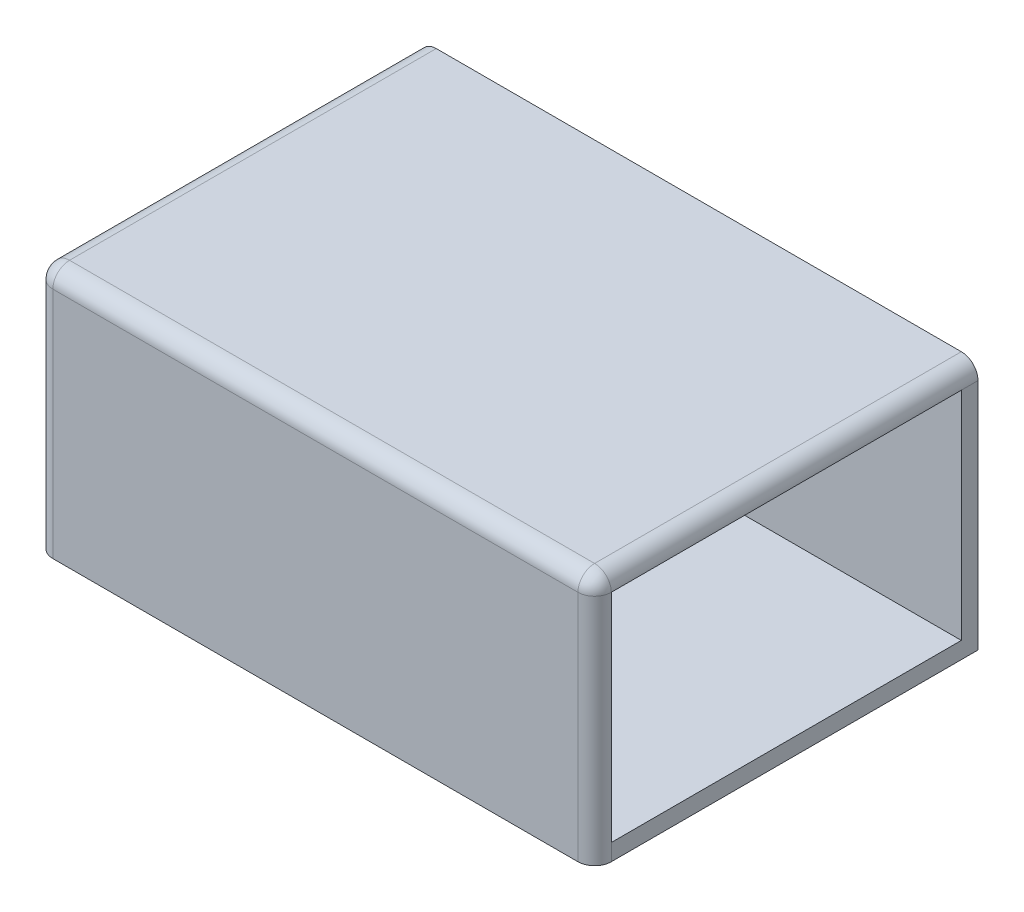
ISO-10303-21;
HEADER;
FILE_DESCRIPTION(('STEP AP214'),'2;1');
FILE_NAME('part.step','',(''),(''),'','','');
FILE_SCHEMA(('AUTOMOTIVE_DESIGN { 1 0 10303 214 1 1 1 1 }'));
ENDSEC;
DATA;
#1=APPLICATION_CONTEXT('core data for automotive mechanical design processes');
#2=APPLICATION_PROTOCOL_DEFINITION('international standard','automotive_design',2000,#1);
#3=PRODUCT_CONTEXT('',#1,'mechanical');
#4=PRODUCT('Part','Part','',(#3));
#5=PRODUCT_RELATED_PRODUCT_CATEGORY('part','',(#4));
#6=PRODUCT_DEFINITION_FORMATION('','',#4);
#7=PRODUCT_DEFINITION_CONTEXT('part definition',#1,'design');
#8=PRODUCT_DEFINITION('design','',#6,#7);
#9=PRODUCT_DEFINITION_SHAPE('','',#8);
#10=(LENGTH_UNIT() NAMED_UNIT(*) SI_UNIT(.MILLI.,.METRE.));
#11=(NAMED_UNIT(*) PLANE_ANGLE_UNIT() SI_UNIT($,.RADIAN.));
#12=(NAMED_UNIT(*) SI_UNIT($,.STERADIAN.) SOLID_ANGLE_UNIT());
#13=UNCERTAINTY_MEASURE_WITH_UNIT(LENGTH_MEASURE(1.E-05),#10,'distance_accuracy_value','');
#14=(GEOMETRIC_REPRESENTATION_CONTEXT(3) GLOBAL_UNCERTAINTY_ASSIGNED_CONTEXT((#13)) GLOBAL_UNIT_ASSIGNED_CONTEXT((#10,
#11,#12)) REPRESENTATION_CONTEXT('',''));
#15=CARTESIAN_POINT('',(0.,0.,0.));
#16=DIRECTION('',(0.,0.,1.));
#17=DIRECTION('',(1.,0.,0.));
#18=AXIS2_PLACEMENT_3D('',#15,#16,#17);
#19=CARTESIAN_POINT('',(45.72,38.1,-17.5683333333333));
#20=DIRECTION('',(-1.,0.,0.));
#21=DIRECTION('',(0.,0.,1.));
#22=AXIS2_PLACEMENT_3D('',#19,#20,#21);
#23=PLANE('',#22);
#24=DIRECTION('',(0.,-1.,0.));
#25=VECTOR('',#24,1.);
#26=CARTESIAN_POINT('',(45.72,38.1,-17.5683333333333));
#27=LINE('',#26,#25);
#28=CARTESIAN_POINT('',(45.72,35.56,-17.5683333333333));
#29=VERTEX_POINT('',#28);
#30=CARTESIAN_POINT('',(45.72,0.,-17.5683333333333));
#31=VERTEX_POINT('',#30);
#32=EDGE_CURVE('E214',#29,#31,#27,.T.);
#33=ORIENTED_EDGE('',*,*,#32,.F.);
#34=DIRECTION('',(0.,0.,-1.));
#35=VECTOR('',#34,1.);
#36=CARTESIAN_POINT('',(45.72,35.56,40.8516666666667));
#37=LINE('',#36,#35);
#38=CARTESIAN_POINT('',(45.72,35.56,-15.0283333333333));
#39=VERTEX_POINT('',#38);
#40=EDGE_CURVE('E11',#29,#39,#37,.F.);
#41=ORIENTED_EDGE('',*,*,#40,.T.);
#42=DIRECTION('',(0.,-1.,0.));
#43=VECTOR('',#42,1.);
#44=CARTESIAN_POINT('',(45.72,38.1,-15.0283333333333));
#45=LINE('',#44,#43);
#46=CARTESIAN_POINT('',(45.72,2.54,-15.0283333333333));
#47=VERTEX_POINT('',#46);
#48=EDGE_CURVE('E173',#39,#47,#45,.T.);
#49=ORIENTED_EDGE('',*,*,#48,.T.);
#50=DIRECTION('',(0.,0.,-1.));
#51=VECTOR('',#50,1.);
#52=CARTESIAN_POINT('',(45.72,2.54,-17.5683333333333));
#53=LINE('',#52,#51);
#54=CARTESIAN_POINT('',(45.72,2.54,38.3116666666667));
#55=VERTEX_POINT('',#54);
#56=EDGE_CURVE('E145',#55,#47,#53,.T.);
#57=ORIENTED_EDGE('',*,*,#56,.F.);
#58=DIRECTION('',(0.,-1.,0.));
#59=VECTOR('',#58,1.);
#60=CARTESIAN_POINT('',(45.72,38.1,38.3116666666667));
#61=LINE('',#60,#59);
#62=CARTESIAN_POINT('',(45.72,0.,38.3116666666667));
#63=VERTEX_POINT('',#62);
#64=EDGE_CURVE('E54',#55,#63,#61,.T.);
#65=ORIENTED_EDGE('',*,*,#64,.T.);
#66=DIRECTION('',(0.,0.,-1.));
#67=VECTOR('',#66,1.);
#68=CARTESIAN_POINT('',(45.72,0.,-17.5683333333333));
#69=LINE('',#68,#67);
#70=EDGE_CURVE('E205',#63,#31,#69,.T.);
#71=ORIENTED_EDGE('',*,*,#70,.T.);
#72=EDGE_LOOP('',(#33,#41,#49,#57,#65,#71));
#73=FACE_BOUND('',#72,.T.);
#74=ADVANCED_FACE('F44',(#73),#23,.F.);
#75=CARTESIAN_POINT('',(-39.37,38.1,-17.5683333333333));
#76=DIRECTION('',(1.,0.,0.));
#77=DIRECTION('',(0.,0.,-1.));
#78=AXIS2_PLACEMENT_3D('',#75,#76,#77);
#79=PLANE('',#78);
#80=DIRECTION('',(0.,0.,1.));
#81=VECTOR('',#80,1.);
#82=CARTESIAN_POINT('',(-39.37,0.,-17.5683333333333));
#83=LINE('',#82,#81);
#84=CARTESIAN_POINT('',(-39.37,0.,-17.5683333333333));
#85=VERTEX_POINT('',#84);
#86=CARTESIAN_POINT('',(-39.37,0.,38.3116666666667));
#87=VERTEX_POINT('',#86);
#88=EDGE_CURVE('E156',#85,#87,#83,.T.);
#89=ORIENTED_EDGE('',*,*,#88,.T.);
#90=DIRECTION('',(0.,-1.,0.));
#91=VECTOR('',#90,1.);
#92=CARTESIAN_POINT('',(-39.37,38.1,38.3116666666667));
#93=LINE('',#92,#91);
#94=CARTESIAN_POINT('',(-39.37,35.56,38.3116666666667));
#95=VERTEX_POINT('',#94);
#96=EDGE_CURVE('E236',#87,#95,#93,.F.);
#97=ORIENTED_EDGE('',*,*,#96,.T.);
#98=DIRECTION('',(0.,0.,1.));
#99=VECTOR('',#98,1.);
#100=CARTESIAN_POINT('',(-39.37,35.56,-17.5683333333333));
#101=LINE('',#100,#99);
#102=CARTESIAN_POINT('',(-39.37,35.56,-17.5683333333333));
#103=VERTEX_POINT('',#102);
#104=EDGE_CURVE('E233',#95,#103,#101,.F.);
#105=ORIENTED_EDGE('',*,*,#104,.T.);
#106=DIRECTION('',(0.,-1.,0.));
#107=VECTOR('',#106,1.);
#108=CARTESIAN_POINT('',(-39.37,38.1,-17.5683333333333));
#109=LINE('',#108,#107);
#110=EDGE_CURVE('E196',#103,#85,#109,.T.);
#111=ORIENTED_EDGE('',*,*,#110,.T.);
#112=EDGE_LOOP('',(#89,#97,#105,#111));
#113=FACE_BOUND('',#112,.T.);
#114=ADVANCED_FACE('F324',(#113),#79,.F.);
#115=CARTESIAN_POINT('',(-39.37,38.1,40.8516666666667));
#116=DIRECTION('',(0.,0.,-1.));
#117=DIRECTION('',(-1.,0.,0.));
#118=AXIS2_PLACEMENT_3D('',#115,#116,#117);
#119=PLANE('',#118);
#120=DIRECTION('',(1.,0.,0.));
#121=VECTOR('',#120,1.);
#122=CARTESIAN_POINT('',(-39.37,35.56,40.8516666666667));
#123=LINE('',#122,#121);
#124=CARTESIAN_POINT('',(43.18,35.56,40.8516666666667));
#125=VERTEX_POINT('',#124);
#126=CARTESIAN_POINT('',(-36.83,35.56,40.8516666666667));
#127=VERTEX_POINT('',#126);
#128=EDGE_CURVE('E220',#125,#127,#123,.F.);
#129=ORIENTED_EDGE('',*,*,#128,.T.);
#130=DIRECTION('',(0.,-1.,0.));
#131=VECTOR('',#130,1.);
#132=CARTESIAN_POINT('',(-36.83,38.1,40.8516666666667));
#133=LINE('',#132,#131);
#134=CARTESIAN_POINT('',(-36.83,0.,40.8516666666667));
#135=VERTEX_POINT('',#134);
#136=EDGE_CURVE('E223',#127,#135,#133,.T.);
#137=ORIENTED_EDGE('',*,*,#136,.T.);
#138=DIRECTION('',(1.,0.,0.));
#139=VECTOR('',#138,1.);
#140=CARTESIAN_POINT('',(-39.37,0.,40.8516666666667));
#141=LINE('',#140,#139);
#142=CARTESIAN_POINT('',(43.18,0.,40.8516666666667));
#143=VERTEX_POINT('',#142);
#144=EDGE_CURVE('E201',#135,#143,#141,.T.);
#145=ORIENTED_EDGE('',*,*,#144,.T.);
#146=DIRECTION('',(0.,-1.,0.));
#147=VECTOR('',#146,1.);
#148=CARTESIAN_POINT('',(43.18,38.1,40.8516666666667));
#149=LINE('',#148,#147);
#150=EDGE_CURVE('E217',#143,#125,#149,.F.);
#151=ORIENTED_EDGE('',*,*,#150,.T.);
#152=EDGE_LOOP('',(#129,#137,#145,#151));
#153=FACE_BOUND('',#152,.T.);
#154=ADVANCED_FACE('F301',(#153),#119,.F.);
#155=CARTESIAN_POINT('',(-39.37,38.1,-17.5683333333333));
#156=DIRECTION('',(0.,0.,1.));
#157=DIRECTION('',(1.,0.,0.));
#158=AXIS2_PLACEMENT_3D('',#155,#156,#157);
#159=PLANE('',#158);
#160=ORIENTED_EDGE('',*,*,#110,.F.);
#161=CARTESIAN_POINT('',(-36.83,35.56,-17.5683333333333));
#162=DIRECTION('',(0.,0.,1.));
#163=DIRECTION('',(1.,0.,0.));
#164=AXIS2_PLACEMENT_3D('',#161,#162,#163);
#165=CIRCLE('',#164,2.54);
#166=CARTESIAN_POINT('',(-36.83,38.1,-17.5683333333333));
#167=VERTEX_POINT('',#166);
#168=EDGE_CURVE('E249',#103,#167,#165,.F.);
#169=ORIENTED_EDGE('',*,*,#168,.T.);
#170=DIRECTION('',(-1.,0.,0.));
#171=VECTOR('',#170,1.);
#172=CARTESIAN_POINT('',(-39.37,38.1,-17.5683333333333));
#173=LINE('',#172,#171);
#174=CARTESIAN_POINT('',(43.18,38.1,-17.5683333333333));
#175=VERTEX_POINT('',#174);
#176=EDGE_CURVE('E193',#175,#167,#173,.T.);
#177=ORIENTED_EDGE('',*,*,#176,.F.);
#178=CARTESIAN_POINT('',(43.18,35.56,-17.5683333333333));
#179=DIRECTION('',(0.,0.,1.));
#180=DIRECTION('',(1.,0.,0.));
#181=AXIS2_PLACEMENT_3D('',#178,#179,#180);
#182=CIRCLE('',#181,2.54);
#183=EDGE_CURVE('E62',#175,#29,#182,.F.);
#184=ORIENTED_EDGE('',*,*,#183,.T.);
#185=ORIENTED_EDGE('',*,*,#32,.T.);
#186=DIRECTION('',(-1.,0.,0.));
#187=VECTOR('',#186,1.);
#188=CARTESIAN_POINT('',(-39.37,0.,-17.5683333333333));
#189=LINE('',#188,#187);
#190=EDGE_CURVE('E197',#31,#85,#189,.T.);
#191=ORIENTED_EDGE('',*,*,#190,.T.);
#192=EDGE_LOOP('',(#160,#169,#177,#184,#185,#191));
#193=FACE_BOUND('',#192,.T.);
#194=ADVANCED_FACE('F287',(#193),#159,.F.);
#195=CARTESIAN_POINT('',(0.,38.1,0.));
#196=DIRECTION('',(0.,1.,0.));
#197=DIRECTION('',(0.,0.,1.));
#198=AXIS2_PLACEMENT_3D('',#195,#196,#197);
#199=PLANE('',#198);
#200=ORIENTED_EDGE('',*,*,#176,.T.);
#201=DIRECTION('',(0.,0.,1.));
#202=VECTOR('',#201,1.);
#203=CARTESIAN_POINT('',(-36.83,38.1,40.8516666666667));
#204=LINE('',#203,#202);
#205=CARTESIAN_POINT('',(-36.83,38.1,38.3116666666667));
#206=VERTEX_POINT('',#205);
#207=EDGE_CURVE('E70',#167,#206,#204,.T.);
#208=ORIENTED_EDGE('',*,*,#207,.T.);
#209=DIRECTION('',(1.,0.,0.));
#210=VECTOR('',#209,1.);
#211=CARTESIAN_POINT('',(45.72,38.1,38.3116666666667));
#212=LINE('',#211,#210);
#213=CARTESIAN_POINT('',(43.18,38.1,38.3116666666667));
#214=VERTEX_POINT('',#213);
#215=EDGE_CURVE('E242',#206,#214,#212,.T.);
#216=ORIENTED_EDGE('',*,*,#215,.T.);
#217=DIRECTION('',(0.,0.,-1.));
#218=VECTOR('',#217,1.);
#219=CARTESIAN_POINT('',(43.18,38.1,-17.5683333333333));
#220=LINE('',#219,#218);
#221=EDGE_CURVE('E239',#214,#175,#220,.T.);
#222=ORIENTED_EDGE('',*,*,#221,.T.);
#223=EDGE_LOOP('',(#200,#208,#216,#222));
#224=FACE_BOUND('',#223,.T.);
#225=ADVANCED_FACE('F285',(#224),#199,.T.);
#226=CARTESIAN_POINT('',(0.,0.,0.));
#227=DIRECTION('',(0.,1.,0.));
#228=DIRECTION('',(0.,0.,1.));
#229=AXIS2_PLACEMENT_3D('',#226,#227,#228);
#230=PLANE('',#229);
#231=ORIENTED_EDGE('',*,*,#144,.F.);
#232=CARTESIAN_POINT('',(-36.83,0.,38.3116666666667));
#233=DIRECTION('',(0.,1.,0.));
#234=DIRECTION('',(0.,0.,1.));
#235=AXIS2_PLACEMENT_3D('',#232,#233,#234);
#236=CIRCLE('',#235,2.54);
#237=EDGE_CURVE('E230',#135,#87,#236,.F.);
#238=ORIENTED_EDGE('',*,*,#237,.T.);
#239=ORIENTED_EDGE('',*,*,#88,.F.);
#240=ORIENTED_EDGE('',*,*,#190,.F.);
#241=ORIENTED_EDGE('',*,*,#70,.F.);
#242=CARTESIAN_POINT('',(43.18,0.,38.3116666666667));
#243=DIRECTION('',(0.,1.,0.));
#244=DIRECTION('',(0.,0.,1.));
#245=AXIS2_PLACEMENT_3D('',#242,#243,#244);
#246=CIRCLE('',#245,2.54);
#247=EDGE_CURVE('E227',#63,#143,#246,.F.);
#248=ORIENTED_EDGE('',*,*,#247,.T.);
#249=EDGE_LOOP('',(#231,#238,#239,#240,#241,#248));
#250=FACE_BOUND('',#249,.T.);
#251=ADVANCED_FACE('F304',(#250),#230,.F.);
#252=CARTESIAN_POINT('',(-36.83,38.1,-17.5683333333333));
#253=DIRECTION('',(1.,0.,0.));
#254=DIRECTION('',(0.,0.,-1.));
#255=AXIS2_PLACEMENT_3D('',#252,#253,#254);
#256=PLANE('',#255);
#257=DIRECTION('',(0.,0.,1.));
#258=VECTOR('',#257,1.);
#259=CARTESIAN_POINT('',(-36.83,2.54,-17.5683333333333));
#260=LINE('',#259,#258);
#261=CARTESIAN_POINT('',(-36.83,2.54,-15.0283333333333));
#262=VERTEX_POINT('',#261);
#263=CARTESIAN_POINT('',(-36.83,2.54,38.3116666666667));
#264=VERTEX_POINT('',#263);
#265=EDGE_CURVE('E146',#262,#264,#260,.T.);
#266=ORIENTED_EDGE('',*,*,#265,.F.);
#267=DIRECTION('',(0.,-1.,0.));
#268=VECTOR('',#267,1.);
#269=CARTESIAN_POINT('',(-36.83,38.1,-15.0283333333333));
#270=LINE('',#269,#268);
#271=CARTESIAN_POINT('',(-36.83,35.56,-15.0283333333333));
#272=VERTEX_POINT('',#271);
#273=EDGE_CURVE('E171',#272,#262,#270,.T.);
#274=ORIENTED_EDGE('',*,*,#273,.F.);
#275=DIRECTION('',(0.,0.,1.));
#276=VECTOR('',#275,1.);
#277=CARTESIAN_POINT('',(-36.83,35.56,-17.5683333333333));
#278=LINE('',#277,#276);
#279=CARTESIAN_POINT('',(-36.83,35.56,38.3116666666667));
#280=VERTEX_POINT('',#279);
#281=EDGE_CURVE('E154',#272,#280,#278,.T.);
#282=ORIENTED_EDGE('',*,*,#281,.T.);
#283=DIRECTION('',(0.,-1.,0.));
#284=VECTOR('',#283,1.);
#285=CARTESIAN_POINT('',(-36.83,38.1,38.3116666666667));
#286=LINE('',#285,#284);
#287=EDGE_CURVE('E138',#280,#264,#286,.T.);
#288=ORIENTED_EDGE('',*,*,#287,.T.);
#289=EDGE_LOOP('',(#266,#274,#282,#288));
#290=FACE_BOUND('',#289,.T.);
#291=ADVANCED_FACE('F151',(#290),#256,.T.);
#292=CARTESIAN_POINT('',(-39.37,38.1,38.3116666666667));
#293=DIRECTION('',(0.,0.,-1.));
#294=DIRECTION('',(-1.,0.,0.));
#295=AXIS2_PLACEMENT_3D('',#292,#293,#294);
#296=PLANE('',#295);
#297=DIRECTION('',(1.,0.,0.));
#298=VECTOR('',#297,1.);
#299=CARTESIAN_POINT('',(-39.37,2.54,38.3116666666667));
#300=LINE('',#299,#298);
#301=EDGE_CURVE('E134',#264,#55,#300,.T.);
#302=ORIENTED_EDGE('',*,*,#301,.F.);
#303=ORIENTED_EDGE('',*,*,#287,.F.);
#304=DIRECTION('',(1.,0.,0.));
#305=VECTOR('',#304,1.);
#306=CARTESIAN_POINT('',(-39.37,35.56,38.3116666666667));
#307=LINE('',#306,#305);
#308=CARTESIAN_POINT('',(45.72,35.56,38.3116666666667));
#309=VERTEX_POINT('',#308);
#310=EDGE_CURVE('E170',#280,#309,#307,.T.);
#311=ORIENTED_EDGE('',*,*,#310,.T.);
#312=DIRECTION('',(0.,-1.,0.));
#313=VECTOR('',#312,1.);
#314=CARTESIAN_POINT('',(45.72,38.1,38.3116666666667));
#315=LINE('',#314,#313);
#316=EDGE_CURVE('E140',#309,#55,#315,.T.);
#317=ORIENTED_EDGE('',*,*,#316,.T.);
#318=EDGE_LOOP('',(#302,#303,#311,#317));
#319=FACE_BOUND('',#318,.T.);
#320=ADVANCED_FACE('F136',(#319),#296,.T.);
#321=CARTESIAN_POINT('',(-39.37,38.1,-15.0283333333333));
#322=DIRECTION('',(0.,0.,1.));
#323=DIRECTION('',(1.,0.,0.));
#324=AXIS2_PLACEMENT_3D('',#321,#322,#323);
#325=PLANE('',#324);
#326=DIRECTION('',(-1.,0.,0.));
#327=VECTOR('',#326,1.);
#328=CARTESIAN_POINT('',(-39.37,2.54,-15.0283333333333));
#329=LINE('',#328,#327);
#330=EDGE_CURVE('E160',#47,#262,#329,.T.);
#331=ORIENTED_EDGE('',*,*,#330,.F.);
#332=ORIENTED_EDGE('',*,*,#48,.F.);
#333=DIRECTION('',(-1.,0.,0.));
#334=VECTOR('',#333,1.);
#335=CARTESIAN_POINT('',(-39.37,35.56,-15.0283333333333));
#336=LINE('',#335,#334);
#337=EDGE_CURVE('E174',#39,#272,#336,.T.);
#338=ORIENTED_EDGE('',*,*,#337,.T.);
#339=ORIENTED_EDGE('',*,*,#273,.T.);
#340=EDGE_LOOP('',(#331,#332,#338,#339));
#341=FACE_BOUND('',#340,.T.);
#342=ADVANCED_FACE('F311',(#341),#325,.T.);
#343=CARTESIAN_POINT('',(0.,35.56,0.));
#344=DIRECTION('',(0.,1.,0.));
#345=DIRECTION('',(0.,0.,1.));
#346=AXIS2_PLACEMENT_3D('',#343,#344,#345);
#347=PLANE('',#346);
#348=ORIENTED_EDGE('',*,*,#281,.F.);
#349=ORIENTED_EDGE('',*,*,#337,.F.);
#350=DIRECTION('',(0.,0.,-1.));
#351=VECTOR('',#350,1.);
#352=CARTESIAN_POINT('',(45.72,35.56,-17.5683333333333));
#353=LINE('',#352,#351);
#354=EDGE_CURVE('E178',#309,#39,#353,.T.);
#355=ORIENTED_EDGE('',*,*,#354,.F.);
#356=ORIENTED_EDGE('',*,*,#310,.F.);
#357=EDGE_LOOP('',(#348,#349,#355,#356));
#358=FACE_BOUND('',#357,.T.);
#359=ADVANCED_FACE('F314',(#358),#347,.F.);
#360=CARTESIAN_POINT('',(0.,2.54,0.));
#361=DIRECTION('',(0.,1.,0.));
#362=DIRECTION('',(0.,0.,1.));
#363=AXIS2_PLACEMENT_3D('',#360,#361,#362);
#364=PLANE('',#363);
#365=ORIENTED_EDGE('',*,*,#265,.T.);
#366=ORIENTED_EDGE('',*,*,#301,.T.);
#367=ORIENTED_EDGE('',*,*,#56,.T.);
#368=ORIENTED_EDGE('',*,*,#330,.T.);
#369=EDGE_LOOP('',(#365,#366,#367,#368));
#370=FACE_BOUND('',#369,.T.);
#371=ADVANCED_FACE('F158',(#370),#364,.T.);
#372=CARTESIAN_POINT('',(43.18,35.56,0.));
#373=DIRECTION('',(0.,0.,1.));
#374=DIRECTION('',(1.,0.,0.));
#375=AXIS2_PLACEMENT_3D('',#372,#373,#374);
#376=CYLINDRICAL_SURFACE('',#375,2.54);
#377=ORIENTED_EDGE('',*,*,#183,.F.);
#378=ORIENTED_EDGE('',*,*,#221,.F.);
#379=CARTESIAN_POINT('',(43.18,35.56,38.3116666666667));
#380=DIRECTION('',(0.,0.,1.));
#381=DIRECTION('',(1.,0.,0.));
#382=AXIS2_PLACEMENT_3D('',#379,#380,#381);
#383=CIRCLE('',#382,2.54);
#384=EDGE_CURVE('E48',#309,#214,#383,.T.);
#385=ORIENTED_EDGE('',*,*,#384,.F.);
#386=ORIENTED_EDGE('',*,*,#354,.T.);
#387=ORIENTED_EDGE('',*,*,#40,.F.);
#388=EDGE_LOOP('',(#377,#378,#385,#386,#387));
#389=FACE_BOUND('',#388,.T.);
#390=ADVANCED_FACE('F46',(#389),#376,.T.);
#391=CARTESIAN_POINT('',(43.18,38.1,38.3116666666667));
#392=DIRECTION('',(0.,-1.,0.));
#393=DIRECTION('',(0.,0.,-1.));
#394=AXIS2_PLACEMENT_3D('',#391,#392,#393);
#395=CYLINDRICAL_SURFACE('',#394,2.54);
#396=ORIENTED_EDGE('',*,*,#64,.F.);
#397=ORIENTED_EDGE('',*,*,#316,.F.);
#398=CARTESIAN_POINT('',(43.18,35.56,38.3116666666667));
#399=DIRECTION('',(0.,1.,0.));
#400=DIRECTION('',(0.,0.,1.));
#401=AXIS2_PLACEMENT_3D('',#398,#399,#400);
#402=CIRCLE('',#401,2.54);
#403=EDGE_CURVE('E166',#125,#309,#402,.T.);
#404=ORIENTED_EDGE('',*,*,#403,.F.);
#405=ORIENTED_EDGE('',*,*,#150,.F.);
#406=ORIENTED_EDGE('',*,*,#247,.F.);
#407=EDGE_LOOP('',(#396,#397,#404,#405,#406));
#408=FACE_BOUND('',#407,.T.);
#409=ADVANCED_FACE('F280',(#408),#395,.T.);
#410=CARTESIAN_POINT('',(43.18,35.56,38.3116666666667));
#411=DIRECTION('',(1.,0.,0.));
#412=DIRECTION('',(0.,0.,-1.));
#413=AXIS2_PLACEMENT_3D('',#410,#411,#412);
#414=SPHERICAL_SURFACE('',#413,2.54);
#415=ORIENTED_EDGE('',*,*,#403,.T.);
#416=ORIENTED_EDGE('',*,*,#384,.T.);
#417=CARTESIAN_POINT('',(43.18,35.56,38.3116666666667));
#418=DIRECTION('',(1.,0.,0.));
#419=DIRECTION('',(0.,0.,-1.));
#420=AXIS2_PLACEMENT_3D('',#417,#418,#419);
#421=CIRCLE('',#420,2.54);
#422=EDGE_CURVE('E266',#125,#214,#421,.F.);
#423=ORIENTED_EDGE('',*,*,#422,.F.);
#424=EDGE_LOOP('',(#415,#416,#423));
#425=FACE_BOUND('',#424,.T.);
#426=ADVANCED_FACE('F274',(#425),#414,.T.);
#427=CARTESIAN_POINT('',(-36.83,35.56,0.));
#428=DIRECTION('',(0.,0.,-1.));
#429=DIRECTION('',(-1.,0.,0.));
#430=AXIS2_PLACEMENT_3D('',#427,#428,#429);
#431=CYLINDRICAL_SURFACE('',#430,2.54);
#432=ORIENTED_EDGE('',*,*,#168,.F.);
#433=ORIENTED_EDGE('',*,*,#104,.F.);
#434=CARTESIAN_POINT('',(-36.83,35.56,38.3116666666667));
#435=DIRECTION('',(0.,0.,1.));
#436=DIRECTION('',(1.,0.,0.));
#437=AXIS2_PLACEMENT_3D('',#434,#435,#436);
#438=CIRCLE('',#437,2.54);
#439=EDGE_CURVE('E262',#206,#95,#438,.T.);
#440=ORIENTED_EDGE('',*,*,#439,.F.);
#441=ORIENTED_EDGE('',*,*,#207,.F.);
#442=EDGE_LOOP('',(#432,#433,#440,#441));
#443=FACE_BOUND('',#442,.T.);
#444=ADVANCED_FACE('F291',(#443),#431,.T.);
#445=CARTESIAN_POINT('',(0.,35.56,38.3116666666667));
#446=DIRECTION('',(-1.,0.,0.));
#447=DIRECTION('',(0.,0.,1.));
#448=AXIS2_PLACEMENT_3D('',#445,#446,#447);
#449=CYLINDRICAL_SURFACE('',#448,2.54);
#450=ORIENTED_EDGE('',*,*,#422,.T.);
#451=ORIENTED_EDGE('',*,*,#215,.F.);
#452=CARTESIAN_POINT('',(-36.83,35.56,38.3116666666667));
#453=DIRECTION('',(-1.,0.,0.));
#454=DIRECTION('',(0.,0.,1.));
#455=AXIS2_PLACEMENT_3D('',#452,#453,#454);
#456=CIRCLE('',#455,2.54);
#457=EDGE_CURVE('E258',#127,#206,#456,.T.);
#458=ORIENTED_EDGE('',*,*,#457,.F.);
#459=ORIENTED_EDGE('',*,*,#128,.F.);
#460=EDGE_LOOP('',(#450,#451,#458,#459));
#461=FACE_BOUND('',#460,.T.);
#462=ADVANCED_FACE('F299',(#461),#449,.T.);
#463=CARTESIAN_POINT('',(-36.83,35.56,38.3116666666667));
#464=DIRECTION('',(0.,1.,0.));
#465=DIRECTION('',(0.,0.,1.));
#466=AXIS2_PLACEMENT_3D('',#463,#464,#465);
#467=SPHERICAL_SURFACE('',#466,2.54);
#468=ORIENTED_EDGE('',*,*,#457,.T.);
#469=ORIENTED_EDGE('',*,*,#439,.T.);
#470=CARTESIAN_POINT('',(-36.83,35.56,38.3116666666667));
#471=DIRECTION('',(0.,1.,0.));
#472=DIRECTION('',(0.,0.,1.));
#473=AXIS2_PLACEMENT_3D('',#470,#471,#472);
#474=CIRCLE('',#473,2.54);
#475=EDGE_CURVE('E254',#127,#95,#474,.F.);
#476=ORIENTED_EDGE('',*,*,#475,.F.);
#477=EDGE_LOOP('',(#468,#469,#476));
#478=FACE_BOUND('',#477,.T.);
#479=ADVANCED_FACE('F296',(#478),#467,.T.);
#480=CARTESIAN_POINT('',(-36.83,38.1,38.3116666666667));
#481=DIRECTION('',(0.,-1.,0.));
#482=DIRECTION('',(0.,0.,-1.));
#483=AXIS2_PLACEMENT_3D('',#480,#481,#482);
#484=CYLINDRICAL_SURFACE('',#483,2.54);
#485=ORIENTED_EDGE('',*,*,#475,.T.);
#486=ORIENTED_EDGE('',*,*,#96,.F.);
#487=ORIENTED_EDGE('',*,*,#237,.F.);
#488=ORIENTED_EDGE('',*,*,#136,.F.);
#489=EDGE_LOOP('',(#485,#486,#487,#488));
#490=FACE_BOUND('',#489,.T.);
#491=ADVANCED_FACE('F337',(#490),#484,.T.);
#492=CLOSED_SHELL('',(#74,#114,#154,#194,#225,#251,#291,#320,#342,#359,#371,#390,#409,#426,#444,
#462,#479,#491));
#493=MANIFOLD_SOLID_BREP('B2',#492);
#494=ADVANCED_BREP_SHAPE_REPRESENTATION('',(#18,#493),#14);
#495=SHAPE_DEFINITION_REPRESENTATION(#9,#494);
ENDSEC;
END-ISO-10303-21;
